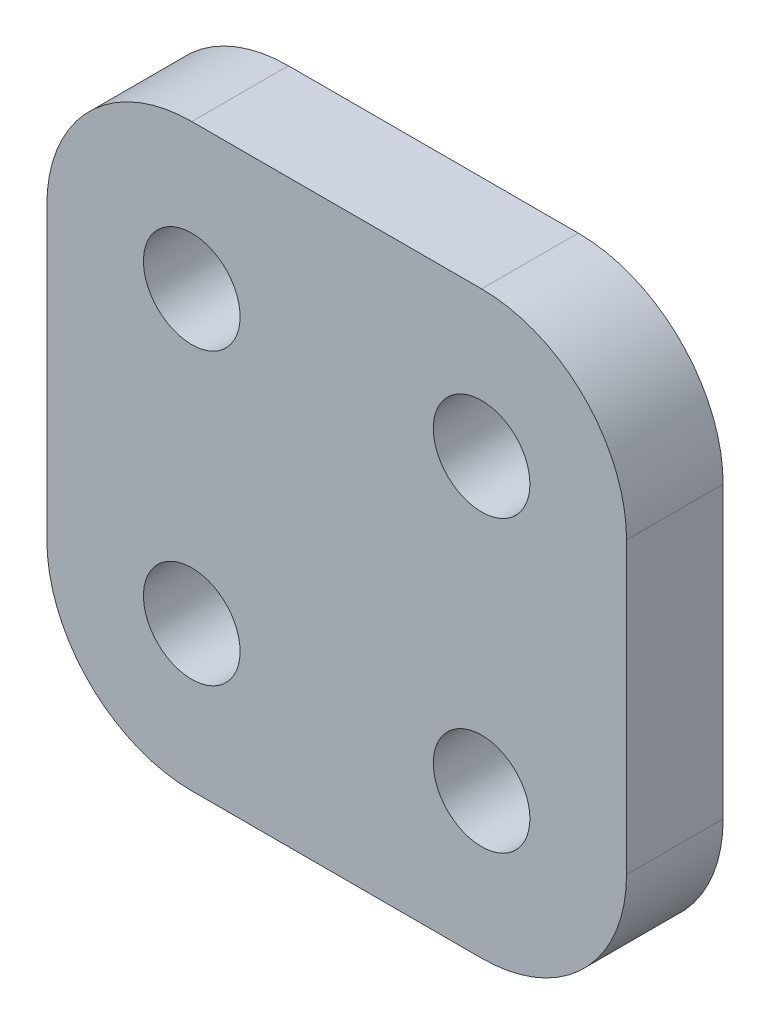
ISO-10303-21;
HEADER;
FILE_DESCRIPTION(('STEP AP214'),'2;1');
FILE_NAME('part.step','',(''),(''),'','','');
FILE_SCHEMA(('AUTOMOTIVE_DESIGN { 1 0 10303 214 1 1 1 1 }'));
ENDSEC;
DATA;
#1=APPLICATION_CONTEXT('core data for automotive mechanical design processes');
#2=APPLICATION_PROTOCOL_DEFINITION('international standard','automotive_design',2000,#1);
#3=PRODUCT_CONTEXT('',#1,'mechanical');
#4=PRODUCT('Part','Part','',(#3));
#5=PRODUCT_RELATED_PRODUCT_CATEGORY('part','',(#4));
#6=PRODUCT_DEFINITION_FORMATION('','',#4);
#7=PRODUCT_DEFINITION_CONTEXT('part definition',#1,'design');
#8=PRODUCT_DEFINITION('design','',#6,#7);
#9=PRODUCT_DEFINITION_SHAPE('','',#8);
#10=(LENGTH_UNIT() NAMED_UNIT(*) SI_UNIT(.MILLI.,.METRE.));
#11=(NAMED_UNIT(*) PLANE_ANGLE_UNIT() SI_UNIT($,.RADIAN.));
#12=(NAMED_UNIT(*) SI_UNIT($,.STERADIAN.) SOLID_ANGLE_UNIT());
#13=UNCERTAINTY_MEASURE_WITH_UNIT(LENGTH_MEASURE(1.E-05),#10,'distance_accuracy_value','');
#14=(GEOMETRIC_REPRESENTATION_CONTEXT(3) GLOBAL_UNCERTAINTY_ASSIGNED_CONTEXT((#13)) GLOBAL_UNIT_ASSIGNED_CONTEXT((#10,
#11,#12)) REPRESENTATION_CONTEXT('',''));
#15=CARTESIAN_POINT('',(0.,0.,0.));
#16=DIRECTION('',(0.,0.,1.));
#17=DIRECTION('',(1.,0.,0.));
#18=AXIS2_PLACEMENT_3D('',#15,#16,#17);
#19=CARTESIAN_POINT('',(204.3359221937,165.8331963046,3.));
#20=DIRECTION('',(0.,0.,1.));
#21=DIRECTION('',(1.,0.,0.));
#22=AXIS2_PLACEMENT_3D('',#19,#20,#21);
#23=PLANE('',#22);
#24=CARTESIAN_POINT('',(204.3359221937,174.8331963046,3.));
#25=DIRECTION('',(0.,0.,1.));
#26=DIRECTION('',(1.,0.,0.));
#27=AXIS2_PLACEMENT_3D('',#24,#25,#26);
#28=CIRCLE('',#27,1.5);
#29=CARTESIAN_POINT('',(205.8359221937,174.8331963046,3.));
#30=VERTEX_POINT('',#29);
#31=EDGE_CURVE('E188',#30,#30,#28,.T.);
#32=ORIENTED_EDGE('',*,*,#31,.F.);
#33=EDGE_LOOP('',(#32));
#34=FACE_BOUND('',#33,.T.);
#35=CARTESIAN_POINT('',(195.3359221937,174.8331963046,3.));
#36=DIRECTION('',(0.,0.,1.));
#37=DIRECTION('',(1.,0.,0.));
#38=AXIS2_PLACEMENT_3D('',#35,#36,#37);
#39=CIRCLE('',#38,1.5);
#40=CARTESIAN_POINT('',(196.8359221937,174.8331963046,3.));
#41=VERTEX_POINT('',#40);
#42=EDGE_CURVE('E134',#41,#41,#39,.T.);
#43=ORIENTED_EDGE('',*,*,#42,.F.);
#44=EDGE_LOOP('',(#43));
#45=FACE_BOUND('',#44,.T.);
#46=CARTESIAN_POINT('',(204.3359221937,165.8331963046,3.));
#47=DIRECTION('',(0.,0.,1.));
#48=DIRECTION('',(1.,0.,0.));
#49=AXIS2_PLACEMENT_3D('',#46,#47,#48);
#50=CIRCLE('',#49,4.49999999999999);
#51=CARTESIAN_POINT('',(204.3359221937,161.3331963046,3.));
#52=VERTEX_POINT('',#51);
#53=CARTESIAN_POINT('',(208.8359221937,165.8331963046,3.));
#54=VERTEX_POINT('',#53);
#55=EDGE_CURVE('E145',#52,#54,#50,.T.);
#56=ORIENTED_EDGE('',*,*,#55,.T.);
#57=DIRECTION('',(0.,1.,0.));
#58=VECTOR('',#57,1.);
#59=CARTESIAN_POINT('',(208.8359221937,165.8331963046,3.));
#60=LINE('',#59,#58);
#61=CARTESIAN_POINT('',(208.8359221937,174.8331963046,3.));
#62=VERTEX_POINT('',#61);
#63=EDGE_CURVE('E93',#54,#62,#60,.T.);
#64=ORIENTED_EDGE('',*,*,#63,.T.);
#65=CARTESIAN_POINT('',(204.3359221937,174.8331963046,3.));
#66=DIRECTION('',(0.,0.,1.));
#67=DIRECTION('',(1.,0.,0.));
#68=AXIS2_PLACEMENT_3D('',#65,#66,#67);
#69=CIRCLE('',#68,4.49999999999998);
#70=CARTESIAN_POINT('',(204.3359221937,179.3331963046,3.));
#71=VERTEX_POINT('',#70);
#72=EDGE_CURVE('E160',#62,#71,#69,.T.);
#73=ORIENTED_EDGE('',*,*,#72,.T.);
#74=DIRECTION('',(-1.,0.,0.));
#75=VECTOR('',#74,1.);
#76=CARTESIAN_POINT('',(204.3359221937,179.3331963046,3.));
#77=LINE('',#76,#75);
#78=CARTESIAN_POINT('',(195.3359221937,179.3331963046,3.));
#79=VERTEX_POINT('',#78);
#80=EDGE_CURVE('E173',#71,#79,#77,.T.);
#81=ORIENTED_EDGE('',*,*,#80,.T.);
#82=CARTESIAN_POINT('',(195.3359221937,174.8331963046,3.));
#83=DIRECTION('',(0.,0.,1.));
#84=DIRECTION('',(1.,0.,0.));
#85=AXIS2_PLACEMENT_3D('',#82,#83,#84);
#86=CIRCLE('',#85,4.49999999999999);
#87=CARTESIAN_POINT('',(190.8359221937,174.8331963046,3.));
#88=VERTEX_POINT('',#87);
#89=EDGE_CURVE('E112',#79,#88,#86,.T.);
#90=ORIENTED_EDGE('',*,*,#89,.T.);
#91=DIRECTION('',(0.,-1.,0.));
#92=VECTOR('',#91,1.);
#93=CARTESIAN_POINT('',(190.8359221937,174.8331963046,3.));
#94=LINE('',#93,#92);
#95=CARTESIAN_POINT('',(190.8359221937,165.8331963046,3.));
#96=VERTEX_POINT('',#95);
#97=EDGE_CURVE('E106',#88,#96,#94,.T.);
#98=ORIENTED_EDGE('',*,*,#97,.T.);
#99=CARTESIAN_POINT('',(195.3359221937,165.8331963046,3.));
#100=DIRECTION('',(0.,0.,1.));
#101=DIRECTION('',(1.,0.,0.));
#102=AXIS2_PLACEMENT_3D('',#99,#100,#101);
#103=CIRCLE('',#102,4.5);
#104=CARTESIAN_POINT('',(195.3359221937,161.3331963046,3.));
#105=VERTEX_POINT('',#104);
#106=EDGE_CURVE('E110',#96,#105,#103,.T.);
#107=ORIENTED_EDGE('',*,*,#106,.T.);
#108=DIRECTION('',(1.,0.,0.));
#109=VECTOR('',#108,1.);
#110=CARTESIAN_POINT('',(195.3359221937,161.3331963046,3.));
#111=LINE('',#110,#109);
#112=EDGE_CURVE('E50',#105,#52,#111,.T.);
#113=ORIENTED_EDGE('',*,*,#112,.T.);
#114=EDGE_LOOP('',(#56,#64,#73,#81,#90,#98,#107,#113));
#115=FACE_BOUND('',#114,.T.);
#116=CARTESIAN_POINT('',(195.3359221937,165.8331963046,3.));
#117=DIRECTION('',(0.,0.,1.));
#118=DIRECTION('',(1.,0.,0.));
#119=AXIS2_PLACEMENT_3D('',#116,#117,#118);
#120=CIRCLE('',#119,1.5);
#121=CARTESIAN_POINT('',(196.8359221937,165.8331963046,3.));
#122=VERTEX_POINT('',#121);
#123=EDGE_CURVE('E182',#122,#122,#120,.T.);
#124=ORIENTED_EDGE('',*,*,#123,.F.);
#125=EDGE_LOOP('',(#124));
#126=FACE_BOUND('',#125,.T.);
#127=CARTESIAN_POINT('',(204.3359221937,165.8331963046,3.));
#128=DIRECTION('',(0.,0.,1.));
#129=DIRECTION('',(1.,0.,0.));
#130=AXIS2_PLACEMENT_3D('',#127,#128,#129);
#131=CIRCLE('',#130,1.5);
#132=CARTESIAN_POINT('',(205.8359221937,165.8331963046,3.));
#133=VERTEX_POINT('',#132);
#134=EDGE_CURVE('E194',#133,#133,#131,.T.);
#135=ORIENTED_EDGE('',*,*,#134,.F.);
#136=EDGE_LOOP('',(#135));
#137=FACE_BOUND('',#136,.T.);
#138=ADVANCED_FACE('F33',(#34,#45,#115,#126,#137),#23,.T.);
#139=CARTESIAN_POINT('',(204.3359221937,165.8331963046,0.));
#140=DIRECTION('',(0.,0.,1.));
#141=DIRECTION('',(1.,0.,0.));
#142=AXIS2_PLACEMENT_3D('',#139,#140,#141);
#143=PLANE('',#142);
#144=CARTESIAN_POINT('',(204.3359221937,174.8331963046,0.));
#145=DIRECTION('',(0.,0.,1.));
#146=DIRECTION('',(1.,0.,0.));
#147=AXIS2_PLACEMENT_3D('',#144,#145,#146);
#148=CIRCLE('',#147,1.5);
#149=CARTESIAN_POINT('',(205.8359221937,174.8331963046,0.));
#150=VERTEX_POINT('',#149);
#151=EDGE_CURVE('E191',#150,#150,#148,.T.);
#152=ORIENTED_EDGE('',*,*,#151,.T.);
#153=EDGE_LOOP('',(#152));
#154=FACE_BOUND('',#153,.T.);
#155=CARTESIAN_POINT('',(195.3359221937,174.8331963046,0.));
#156=DIRECTION('',(0.,0.,1.));
#157=DIRECTION('',(1.,0.,0.));
#158=AXIS2_PLACEMENT_3D('',#155,#156,#157);
#159=CIRCLE('',#158,1.5);
#160=CARTESIAN_POINT('',(196.8359221937,174.8331963046,0.));
#161=VERTEX_POINT('',#160);
#162=EDGE_CURVE('E179',#161,#161,#159,.T.);
#163=ORIENTED_EDGE('',*,*,#162,.T.);
#164=EDGE_LOOP('',(#163));
#165=FACE_BOUND('',#164,.T.);
#166=CARTESIAN_POINT('',(204.3359221937,165.8331963046,0.));
#167=DIRECTION('',(0.,0.,1.));
#168=DIRECTION('',(1.,0.,0.));
#169=AXIS2_PLACEMENT_3D('',#166,#167,#168);
#170=CIRCLE('',#169,4.49999999999999);
#171=CARTESIAN_POINT('',(204.3359221937,161.3331963046,0.));
#172=VERTEX_POINT('',#171);
#173=CARTESIAN_POINT('',(208.8359221937,165.8331963046,0.));
#174=VERTEX_POINT('',#173);
#175=EDGE_CURVE('E130',#172,#174,#170,.T.);
#176=ORIENTED_EDGE('',*,*,#175,.F.);
#177=DIRECTION('',(1.,0.,0.));
#178=VECTOR('',#177,1.);
#179=CARTESIAN_POINT('',(195.3359221937,161.3331963046,0.));
#180=LINE('',#179,#178);
#181=CARTESIAN_POINT('',(195.3359221937,161.3331963046,0.));
#182=VERTEX_POINT('',#181);
#183=EDGE_CURVE('E85',#182,#172,#180,.T.);
#184=ORIENTED_EDGE('',*,*,#183,.F.);
#185=CARTESIAN_POINT('',(195.3359221937,165.8331963046,0.));
#186=DIRECTION('',(0.,0.,1.));
#187=DIRECTION('',(1.,0.,0.));
#188=AXIS2_PLACEMENT_3D('',#185,#186,#187);
#189=CIRCLE('',#188,4.5);
#190=CARTESIAN_POINT('',(190.8359221937,165.8331963046,0.));
#191=VERTEX_POINT('',#190);
#192=EDGE_CURVE('E79',#191,#182,#189,.T.);
#193=ORIENTED_EDGE('',*,*,#192,.F.);
#194=DIRECTION('',(0.,-1.,0.));
#195=VECTOR('',#194,1.);
#196=CARTESIAN_POINT('',(190.8359221937,174.8331963046,0.));
#197=LINE('',#196,#195);
#198=CARTESIAN_POINT('',(190.8359221937,174.8331963046,0.));
#199=VERTEX_POINT('',#198);
#200=EDGE_CURVE('E120',#199,#191,#197,.T.);
#201=ORIENTED_EDGE('',*,*,#200,.F.);
#202=CARTESIAN_POINT('',(195.3359221937,174.8331963046,0.));
#203=DIRECTION('',(0.,0.,1.));
#204=DIRECTION('',(1.,0.,0.));
#205=AXIS2_PLACEMENT_3D('',#202,#203,#204);
#206=CIRCLE('',#205,4.49999999999999);
#207=CARTESIAN_POINT('',(195.3359221937,179.3331963046,0.));
#208=VERTEX_POINT('',#207);
#209=EDGE_CURVE('E140',#208,#199,#206,.T.);
#210=ORIENTED_EDGE('',*,*,#209,.F.);
#211=DIRECTION('',(-1.,0.,0.));
#212=VECTOR('',#211,1.);
#213=CARTESIAN_POINT('',(204.3359221937,179.3331963046,0.));
#214=LINE('',#213,#212);
#215=CARTESIAN_POINT('',(204.3359221937,179.3331963046,0.));
#216=VERTEX_POINT('',#215);
#217=EDGE_CURVE('E138',#216,#208,#214,.T.);
#218=ORIENTED_EDGE('',*,*,#217,.F.);
#219=CARTESIAN_POINT('',(204.3359221937,174.8331963046,0.));
#220=DIRECTION('',(0.,0.,1.));
#221=DIRECTION('',(1.,0.,0.));
#222=AXIS2_PLACEMENT_3D('',#219,#220,#221);
#223=CIRCLE('',#222,4.49999999999998);
#224=CARTESIAN_POINT('',(208.8359221937,174.8331963046,0.));
#225=VERTEX_POINT('',#224);
#226=EDGE_CURVE('E136',#225,#216,#223,.T.);
#227=ORIENTED_EDGE('',*,*,#226,.F.);
#228=DIRECTION('',(0.,1.,0.));
#229=VECTOR('',#228,1.);
#230=CARTESIAN_POINT('',(208.8359221937,165.8331963046,0.));
#231=LINE('',#230,#229);
#232=EDGE_CURVE('E133',#174,#225,#231,.T.);
#233=ORIENTED_EDGE('',*,*,#232,.F.);
#234=EDGE_LOOP('',(#176,#184,#193,#201,#210,#218,#227,#233));
#235=FACE_BOUND('',#234,.T.);
#236=CARTESIAN_POINT('',(195.3359221937,165.8331963046,0.));
#237=DIRECTION('',(0.,0.,1.));
#238=DIRECTION('',(1.,0.,0.));
#239=AXIS2_PLACEMENT_3D('',#236,#237,#238);
#240=CIRCLE('',#239,1.5);
#241=CARTESIAN_POINT('',(196.8359221937,165.8331963046,0.));
#242=VERTEX_POINT('',#241);
#243=EDGE_CURVE('E185',#242,#242,#240,.T.);
#244=ORIENTED_EDGE('',*,*,#243,.T.);
#245=EDGE_LOOP('',(#244));
#246=FACE_BOUND('',#245,.T.);
#247=CARTESIAN_POINT('',(204.3359221937,165.8331963046,0.));
#248=DIRECTION('',(0.,0.,1.));
#249=DIRECTION('',(1.,0.,0.));
#250=AXIS2_PLACEMENT_3D('',#247,#248,#249);
#251=CIRCLE('',#250,1.5);
#252=CARTESIAN_POINT('',(205.8359221937,165.8331963046,0.));
#253=VERTEX_POINT('',#252);
#254=EDGE_CURVE('E197',#253,#253,#251,.T.);
#255=ORIENTED_EDGE('',*,*,#254,.T.);
#256=EDGE_LOOP('',(#255));
#257=FACE_BOUND('',#256,.T.);
#258=ADVANCED_FACE('F164',(#154,#165,#235,#246,#257),#143,.F.);
#259=CARTESIAN_POINT('',(204.3359221937,165.8331963046,3.));
#260=DIRECTION('',(0.,0.,-1.));
#261=DIRECTION('',(-1.,0.,0.));
#262=AXIS2_PLACEMENT_3D('',#259,#260,#261);
#263=CYLINDRICAL_SURFACE('',#262,4.49999999999999);
#264=ORIENTED_EDGE('',*,*,#175,.T.);
#265=DIRECTION('',(0.,0.,-1.));
#266=VECTOR('',#265,1.);
#267=CARTESIAN_POINT('',(208.8359221937,165.8331963046,3.));
#268=LINE('',#267,#266);
#269=EDGE_CURVE('E11',#54,#174,#268,.T.);
#270=ORIENTED_EDGE('',*,*,#269,.F.);
#271=ORIENTED_EDGE('',*,*,#55,.F.);
#272=DIRECTION('',(0.,0.,-1.));
#273=VECTOR('',#272,1.);
#274=CARTESIAN_POINT('',(204.3359221937,161.3331963046,3.));
#275=LINE('',#274,#273);
#276=EDGE_CURVE('E126',#52,#172,#275,.T.);
#277=ORIENTED_EDGE('',*,*,#276,.T.);
#278=EDGE_LOOP('',(#264,#270,#271,#277));
#279=FACE_BOUND('',#278,.T.);
#280=ADVANCED_FACE('F35',(#279),#263,.T.);
#281=CARTESIAN_POINT('',(208.8359221937,165.8331963046,3.));
#282=DIRECTION('',(-1.,0.,0.));
#283=DIRECTION('',(0.,0.,1.));
#284=AXIS2_PLACEMENT_3D('',#281,#282,#283);
#285=PLANE('',#284);
#286=ORIENTED_EDGE('',*,*,#232,.T.);
#287=DIRECTION('',(0.,0.,-1.));
#288=VECTOR('',#287,1.);
#289=CARTESIAN_POINT('',(208.8359221937,174.8331963046,3.));
#290=LINE('',#289,#288);
#291=EDGE_CURVE('E42',#62,#225,#290,.T.);
#292=ORIENTED_EDGE('',*,*,#291,.F.);
#293=ORIENTED_EDGE('',*,*,#63,.F.);
#294=ORIENTED_EDGE('',*,*,#269,.T.);
#295=EDGE_LOOP('',(#286,#292,#293,#294));
#296=FACE_BOUND('',#295,.T.);
#297=ADVANCED_FACE('F232',(#296),#285,.F.);
#298=CARTESIAN_POINT('',(204.3359221937,174.8331963046,3.));
#299=DIRECTION('',(0.,0.,-1.));
#300=DIRECTION('',(-1.,0.,0.));
#301=AXIS2_PLACEMENT_3D('',#298,#299,#300);
#302=CYLINDRICAL_SURFACE('',#301,4.49999999999998);
#303=ORIENTED_EDGE('',*,*,#226,.T.);
#304=DIRECTION('',(0.,0.,-1.));
#305=VECTOR('',#304,1.);
#306=CARTESIAN_POINT('',(204.3359221937,179.3331963046,3.));
#307=LINE('',#306,#305);
#308=EDGE_CURVE('E152',#71,#216,#307,.T.);
#309=ORIENTED_EDGE('',*,*,#308,.F.);
#310=ORIENTED_EDGE('',*,*,#72,.F.);
#311=ORIENTED_EDGE('',*,*,#291,.T.);
#312=EDGE_LOOP('',(#303,#309,#310,#311));
#313=FACE_BOUND('',#312,.T.);
#314=ADVANCED_FACE('F158',(#313),#302,.T.);
#315=CARTESIAN_POINT('',(204.3359221937,179.3331963046,3.));
#316=DIRECTION('',(0.,-1.,0.));
#317=DIRECTION('',(0.,0.,-1.));
#318=AXIS2_PLACEMENT_3D('',#315,#316,#317);
#319=PLANE('',#318);
#320=ORIENTED_EDGE('',*,*,#217,.T.);
#321=DIRECTION('',(0.,0.,-1.));
#322=VECTOR('',#321,1.);
#323=CARTESIAN_POINT('',(195.3359221937,179.3331963046,3.));
#324=LINE('',#323,#322);
#325=EDGE_CURVE('E149',#79,#208,#324,.T.);
#326=ORIENTED_EDGE('',*,*,#325,.F.);
#327=ORIENTED_EDGE('',*,*,#80,.F.);
#328=ORIENTED_EDGE('',*,*,#308,.T.);
#329=EDGE_LOOP('',(#320,#326,#327,#328));
#330=FACE_BOUND('',#329,.T.);
#331=ADVANCED_FACE('F169',(#330),#319,.F.);
#332=CARTESIAN_POINT('',(195.3359221937,174.8331963046,3.));
#333=DIRECTION('',(0.,0.,-1.));
#334=DIRECTION('',(-1.,0.,0.));
#335=AXIS2_PLACEMENT_3D('',#332,#333,#334);
#336=CYLINDRICAL_SURFACE('',#335,4.49999999999999);
#337=ORIENTED_EDGE('',*,*,#209,.T.);
#338=DIRECTION('',(0.,0.,-1.));
#339=VECTOR('',#338,1.);
#340=CARTESIAN_POINT('',(190.8359221937,174.8331963046,3.));
#341=LINE('',#340,#339);
#342=EDGE_CURVE('E121',#88,#199,#341,.T.);
#343=ORIENTED_EDGE('',*,*,#342,.F.);
#344=ORIENTED_EDGE('',*,*,#89,.F.);
#345=ORIENTED_EDGE('',*,*,#325,.T.);
#346=EDGE_LOOP('',(#337,#343,#344,#345));
#347=FACE_BOUND('',#346,.T.);
#348=ADVANCED_FACE('F172',(#347),#336,.T.);
#349=CARTESIAN_POINT('',(190.8359221937,174.8331963046,3.));
#350=DIRECTION('',(1.,0.,0.));
#351=DIRECTION('',(0.,0.,-1.));
#352=AXIS2_PLACEMENT_3D('',#349,#350,#351);
#353=PLANE('',#352);
#354=ORIENTED_EDGE('',*,*,#200,.T.);
#355=DIRECTION('',(0.,0.,-1.));
#356=VECTOR('',#355,1.);
#357=CARTESIAN_POINT('',(190.8359221937,165.8331963046,3.));
#358=LINE('',#357,#356);
#359=EDGE_CURVE('E117',#96,#191,#358,.T.);
#360=ORIENTED_EDGE('',*,*,#359,.F.);
#361=ORIENTED_EDGE('',*,*,#97,.F.);
#362=ORIENTED_EDGE('',*,*,#342,.T.);
#363=EDGE_LOOP('',(#354,#360,#361,#362));
#364=FACE_BOUND('',#363,.T.);
#365=ADVANCED_FACE('F118',(#364),#353,.F.);
#366=CARTESIAN_POINT('',(195.3359221937,165.8331963046,3.));
#367=DIRECTION('',(0.,0.,-1.));
#368=DIRECTION('',(-1.,0.,0.));
#369=AXIS2_PLACEMENT_3D('',#366,#367,#368);
#370=CYLINDRICAL_SURFACE('',#369,4.5);
#371=ORIENTED_EDGE('',*,*,#192,.T.);
#372=DIRECTION('',(0.,0.,-1.));
#373=VECTOR('',#372,1.);
#374=CARTESIAN_POINT('',(195.3359221937,161.3331963046,3.));
#375=LINE('',#374,#373);
#376=EDGE_CURVE('E122',#105,#182,#375,.T.);
#377=ORIENTED_EDGE('',*,*,#376,.F.);
#378=ORIENTED_EDGE('',*,*,#106,.F.);
#379=ORIENTED_EDGE('',*,*,#359,.T.);
#380=EDGE_LOOP('',(#371,#377,#378,#379));
#381=FACE_BOUND('',#380,.T.);
#382=ADVANCED_FACE('F124',(#381),#370,.T.);
#383=CARTESIAN_POINT('',(195.3359221937,161.3331963046,3.));
#384=DIRECTION('',(0.,1.,0.));
#385=DIRECTION('',(0.,0.,1.));
#386=AXIS2_PLACEMENT_3D('',#383,#384,#385);
#387=PLANE('',#386);
#388=ORIENTED_EDGE('',*,*,#183,.T.);
#389=ORIENTED_EDGE('',*,*,#276,.F.);
#390=ORIENTED_EDGE('',*,*,#112,.F.);
#391=ORIENTED_EDGE('',*,*,#376,.T.);
#392=EDGE_LOOP('',(#388,#389,#390,#391));
#393=FACE_BOUND('',#392,.T.);
#394=ADVANCED_FACE('F220',(#393),#387,.F.);
#395=CARTESIAN_POINT('',(195.3359221937,174.8331963046,3.));
#396=DIRECTION('',(0.,0.,-1.));
#397=DIRECTION('',(-1.,0.,0.));
#398=AXIS2_PLACEMENT_3D('',#395,#396,#397);
#399=CYLINDRICAL_SURFACE('',#398,1.5);
#400=ORIENTED_EDGE('',*,*,#42,.T.);
#401=EDGE_LOOP('',(#400));
#402=FACE_BOUND('',#401,.T.);
#403=ORIENTED_EDGE('',*,*,#162,.F.);
#404=EDGE_LOOP('',(#403));
#405=FACE_BOUND('',#404,.T.);
#406=ADVANCED_FACE('F217',(#402,#405),#399,.F.);
#407=CARTESIAN_POINT('',(195.3359221937,165.8331963046,3.));
#408=DIRECTION('',(0.,0.,-1.));
#409=DIRECTION('',(-1.,0.,0.));
#410=AXIS2_PLACEMENT_3D('',#407,#408,#409);
#411=CYLINDRICAL_SURFACE('',#410,1.5);
#412=ORIENTED_EDGE('',*,*,#123,.T.);
#413=EDGE_LOOP('',(#412));
#414=FACE_BOUND('',#413,.T.);
#415=ORIENTED_EDGE('',*,*,#243,.F.);
#416=EDGE_LOOP('',(#415));
#417=FACE_BOUND('',#416,.T.);
#418=ADVANCED_FACE('F296',(#414,#417),#411,.F.);
#419=CARTESIAN_POINT('',(204.3359221937,174.8331963046,3.));
#420=DIRECTION('',(0.,0.,-1.));
#421=DIRECTION('',(-1.,0.,0.));
#422=AXIS2_PLACEMENT_3D('',#419,#420,#421);
#423=CYLINDRICAL_SURFACE('',#422,1.5);
#424=ORIENTED_EDGE('',*,*,#31,.T.);
#425=EDGE_LOOP('',(#424));
#426=FACE_BOUND('',#425,.T.);
#427=ORIENTED_EDGE('',*,*,#151,.F.);
#428=EDGE_LOOP('',(#427));
#429=FACE_BOUND('',#428,.T.);
#430=ADVANCED_FACE('F304',(#426,#429),#423,.F.);
#431=CARTESIAN_POINT('',(204.3359221937,165.8331963046,3.));
#432=DIRECTION('',(0.,0.,-1.));
#433=DIRECTION('',(-1.,0.,0.));
#434=AXIS2_PLACEMENT_3D('',#431,#432,#433);
#435=CYLINDRICAL_SURFACE('',#434,1.5);
#436=ORIENTED_EDGE('',*,*,#134,.T.);
#437=EDGE_LOOP('',(#436));
#438=FACE_BOUND('',#437,.T.);
#439=ORIENTED_EDGE('',*,*,#254,.F.);
#440=EDGE_LOOP('',(#439));
#441=FACE_BOUND('',#440,.T.);
#442=ADVANCED_FACE('F203',(#438,#441),#435,.F.);
#443=CLOSED_SHELL('',(#138,#258,#280,#297,#314,#331,#348,#365,#382,#394,#406,#418,#430,#442));
#444=MANIFOLD_SOLID_BREP('B2',#443);
#445=ADVANCED_BREP_SHAPE_REPRESENTATION('',(#18,#444),#14);
#446=SHAPE_DEFINITION_REPRESENTATION(#9,#445);
ENDSEC;
END-ISO-10303-21;
